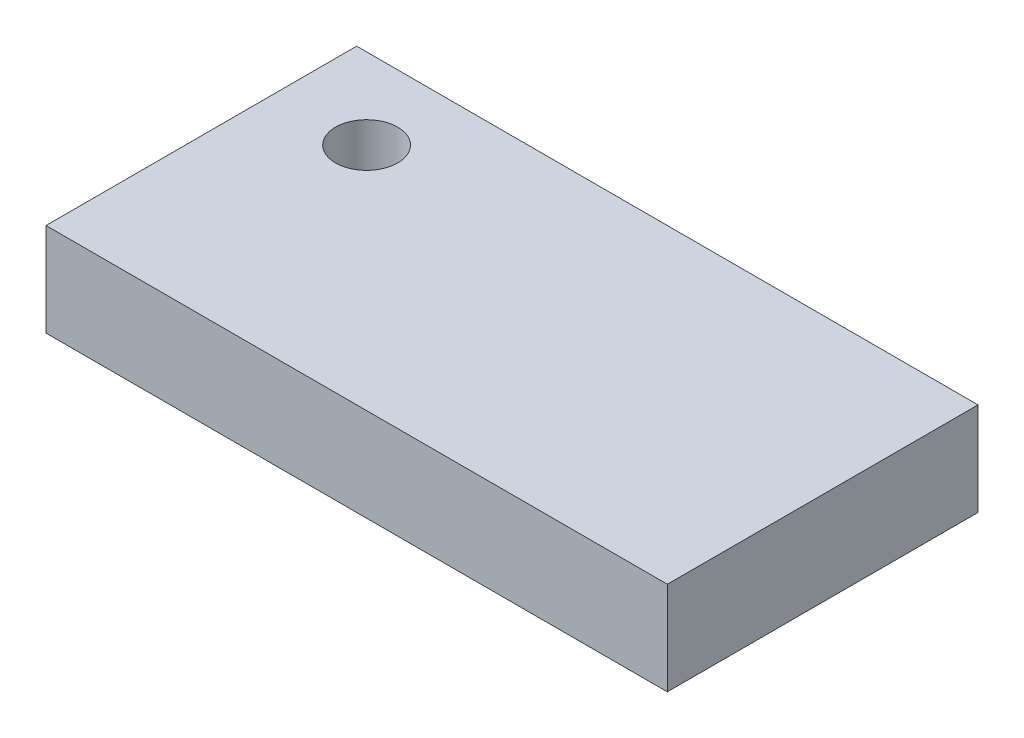
ISO-10303-21;
HEADER;
FILE_DESCRIPTION(('STEP AP214'),'2;1');
FILE_NAME('part.step','',(''),(''),'','','');
FILE_SCHEMA(('AUTOMOTIVE_DESIGN { 1 0 10303 214 1 1 1 1 }'));
ENDSEC;
DATA;
#1=APPLICATION_CONTEXT('core data for automotive mechanical design processes');
#2=APPLICATION_PROTOCOL_DEFINITION('international standard','automotive_design',2000,#1);
#3=PRODUCT_CONTEXT('',#1,'mechanical');
#4=PRODUCT('Part','Part','',(#3));
#5=PRODUCT_RELATED_PRODUCT_CATEGORY('part','',(#4));
#6=PRODUCT_DEFINITION_FORMATION('','',#4);
#7=PRODUCT_DEFINITION_CONTEXT('part definition',#1,'design');
#8=PRODUCT_DEFINITION('design','',#6,#7);
#9=PRODUCT_DEFINITION_SHAPE('','',#8);
#10=(LENGTH_UNIT() NAMED_UNIT(*) SI_UNIT(.MILLI.,.METRE.));
#11=(NAMED_UNIT(*) PLANE_ANGLE_UNIT() SI_UNIT($,.RADIAN.));
#12=(NAMED_UNIT(*) SI_UNIT($,.STERADIAN.) SOLID_ANGLE_UNIT());
#13=UNCERTAINTY_MEASURE_WITH_UNIT(LENGTH_MEASURE(1.E-05),#10,'distance_accuracy_value','');
#14=(GEOMETRIC_REPRESENTATION_CONTEXT(3) GLOBAL_UNCERTAINTY_ASSIGNED_CONTEXT((#13)) GLOBAL_UNIT_ASSIGNED_CONTEXT((#10,
#11,#12)) REPRESENTATION_CONTEXT('',''));
#15=CARTESIAN_POINT('',(0.,0.,0.));
#16=DIRECTION('',(0.,0.,1.));
#17=DIRECTION('',(1.,0.,0.));
#18=AXIS2_PLACEMENT_3D('',#15,#16,#17);
#19=CARTESIAN_POINT('',(50.,15.,16.3343558282208));
#20=DIRECTION('',(-1.,0.,0.));
#21=DIRECTION('',(0.,0.,1.));
#22=AXIS2_PLACEMENT_3D('',#19,#20,#21);
#23=PLANE('',#22);
#24=DIRECTION('',(0.,0.,-1.));
#25=VECTOR('',#24,1.);
#26=CARTESIAN_POINT('',(50.,0.,16.3343558282208));
#27=LINE('',#26,#25);
#28=CARTESIAN_POINT('',(50.,0.,16.3343558282208));
#29=VERTEX_POINT('',#28);
#30=CARTESIAN_POINT('',(50.,0.,-33.6656441717792));
#31=VERTEX_POINT('',#30);
#32=EDGE_CURVE('E96',#29,#31,#27,.T.);
#33=ORIENTED_EDGE('',*,*,#32,.T.);
#34=DIRECTION('',(0.,-1.,0.));
#35=VECTOR('',#34,1.);
#36=CARTESIAN_POINT('',(50.,15.,-33.6656441717792));
#37=LINE('',#36,#35);
#38=CARTESIAN_POINT('',(50.,15.,-33.6656441717792));
#39=VERTEX_POINT('',#38);
#40=EDGE_CURVE('E11',#39,#31,#37,.T.);
#41=ORIENTED_EDGE('',*,*,#40,.F.);
#42=DIRECTION('',(0.,0.,-1.));
#43=VECTOR('',#42,1.);
#44=CARTESIAN_POINT('',(50.,15.,16.3343558282208));
#45=LINE('',#44,#43);
#46=CARTESIAN_POINT('',(50.,15.,16.3343558282208));
#47=VERTEX_POINT('',#46);
#48=EDGE_CURVE('E84',#47,#39,#45,.T.);
#49=ORIENTED_EDGE('',*,*,#48,.F.);
#50=DIRECTION('',(0.,-1.,0.));
#51=VECTOR('',#50,1.);
#52=CARTESIAN_POINT('',(50.,15.,16.3343558282208));
#53=LINE('',#52,#51);
#54=EDGE_CURVE('E92',#47,#29,#53,.T.);
#55=ORIENTED_EDGE('',*,*,#54,.T.);
#56=EDGE_LOOP('',(#33,#41,#49,#55));
#57=FACE_BOUND('',#56,.T.);
#58=ADVANCED_FACE('F33',(#57),#23,.F.);
#59=CARTESIAN_POINT('',(-50.,15.,-33.6656441717792));
#60=DIRECTION('',(0.,0.,1.));
#61=DIRECTION('',(1.,0.,0.));
#62=AXIS2_PLACEMENT_3D('',#59,#60,#61);
#63=PLANE('',#62);
#64=DIRECTION('',(-1.,0.,0.));
#65=VECTOR('',#64,1.);
#66=CARTESIAN_POINT('',(-50.,0.,-33.6656441717792));
#67=LINE('',#66,#65);
#68=CARTESIAN_POINT('',(-50.,0.,-33.6656441717792));
#69=VERTEX_POINT('',#68);
#70=EDGE_CURVE('E88',#31,#69,#67,.T.);
#71=ORIENTED_EDGE('',*,*,#70,.T.);
#72=DIRECTION('',(0.,-1.,0.));
#73=VECTOR('',#72,1.);
#74=CARTESIAN_POINT('',(-50.,15.,-33.6656441717792));
#75=LINE('',#74,#73);
#76=CARTESIAN_POINT('',(-50.,15.,-33.6656441717792));
#77=VERTEX_POINT('',#76);
#78=EDGE_CURVE('E41',#77,#69,#75,.T.);
#79=ORIENTED_EDGE('',*,*,#78,.F.);
#80=DIRECTION('',(-1.,0.,0.));
#81=VECTOR('',#80,1.);
#82=CARTESIAN_POINT('',(-50.,15.,-33.6656441717792));
#83=LINE('',#82,#81);
#84=EDGE_CURVE('E79',#39,#77,#83,.T.);
#85=ORIENTED_EDGE('',*,*,#84,.F.);
#86=ORIENTED_EDGE('',*,*,#40,.T.);
#87=EDGE_LOOP('',(#71,#79,#85,#86));
#88=FACE_BOUND('',#87,.T.);
#89=ADVANCED_FACE('F87',(#88),#63,.F.);
#90=CARTESIAN_POINT('',(-50.,15.,16.3343558282208));
#91=DIRECTION('',(1.,0.,0.));
#92=DIRECTION('',(0.,0.,-1.));
#93=AXIS2_PLACEMENT_3D('',#90,#91,#92);
#94=PLANE('',#93);
#95=DIRECTION('',(0.,0.,1.));
#96=VECTOR('',#95,1.);
#97=CARTESIAN_POINT('',(-50.,0.,16.3343558282208));
#98=LINE('',#97,#96);
#99=CARTESIAN_POINT('',(-50.,0.,16.3343558282208));
#100=VERTEX_POINT('',#99);
#101=EDGE_CURVE('E66',#69,#100,#98,.T.);
#102=ORIENTED_EDGE('',*,*,#101,.T.);
#103=DIRECTION('',(0.,-1.,0.));
#104=VECTOR('',#103,1.);
#105=CARTESIAN_POINT('',(-50.,15.,16.3343558282208));
#106=LINE('',#105,#104);
#107=CARTESIAN_POINT('',(-50.,15.,16.3343558282208));
#108=VERTEX_POINT('',#107);
#109=EDGE_CURVE('E89',#108,#100,#106,.T.);
#110=ORIENTED_EDGE('',*,*,#109,.F.);
#111=DIRECTION('',(0.,0.,1.));
#112=VECTOR('',#111,1.);
#113=CARTESIAN_POINT('',(-50.,15.,16.3343558282208));
#114=LINE('',#113,#112);
#115=EDGE_CURVE('E82',#77,#108,#114,.T.);
#116=ORIENTED_EDGE('',*,*,#115,.F.);
#117=ORIENTED_EDGE('',*,*,#78,.T.);
#118=EDGE_LOOP('',(#102,#110,#116,#117));
#119=FACE_BOUND('',#118,.T.);
#120=ADVANCED_FACE('F90',(#119),#94,.F.);
#121=CARTESIAN_POINT('',(-50.,15.,16.3343558282208));
#122=DIRECTION('',(0.,0.,-1.));
#123=DIRECTION('',(-1.,0.,0.));
#124=AXIS2_PLACEMENT_3D('',#121,#122,#123);
#125=PLANE('',#124);
#126=DIRECTION('',(1.,0.,0.));
#127=VECTOR('',#126,1.);
#128=CARTESIAN_POINT('',(-50.,0.,16.3343558282208));
#129=LINE('',#128,#127);
#130=EDGE_CURVE('E72',#100,#29,#129,.T.);
#131=ORIENTED_EDGE('',*,*,#130,.T.);
#132=ORIENTED_EDGE('',*,*,#54,.F.);
#133=DIRECTION('',(1.,0.,0.));
#134=VECTOR('',#133,1.);
#135=CARTESIAN_POINT('',(-50.,15.,16.3343558282208));
#136=LINE('',#135,#134);
#137=EDGE_CURVE('E49',#108,#47,#136,.T.);
#138=ORIENTED_EDGE('',*,*,#137,.F.);
#139=ORIENTED_EDGE('',*,*,#109,.T.);
#140=EDGE_LOOP('',(#131,#132,#138,#139));
#141=FACE_BOUND('',#140,.T.);
#142=ADVANCED_FACE('F104',(#141),#125,.F.);
#143=CARTESIAN_POINT('',(0.,15.,0.));
#144=DIRECTION('',(0.,-1.,0.));
#145=DIRECTION('',(0.,0.,-1.));
#146=AXIS2_PLACEMENT_3D('',#143,#144,#145);
#147=PLANE('',#146);
#148=CARTESIAN_POINT('',(-35.4172076381492,15.,-20.6808613564249));
#149=DIRECTION('',(0.,1.,0.));
#150=DIRECTION('',(0.,0.,1.));
#151=AXIS2_PLACEMENT_3D('',#148,#149,#150);
#152=CIRCLE('',#151,5.);
#153=CARTESIAN_POINT('',(-35.4172076381492,15.,-15.6808613564249));
#154=VERTEX_POINT('',#153);
#155=EDGE_CURVE('E110',#154,#154,#152,.T.);
#156=ORIENTED_EDGE('',*,*,#155,.F.);
#157=EDGE_LOOP('',(#156));
#158=FACE_BOUND('',#157,.T.);
#159=ORIENTED_EDGE('',*,*,#48,.T.);
#160=ORIENTED_EDGE('',*,*,#84,.T.);
#161=ORIENTED_EDGE('',*,*,#115,.T.);
#162=ORIENTED_EDGE('',*,*,#137,.T.);
#163=EDGE_LOOP('',(#159,#160,#161,#162));
#164=FACE_BOUND('',#163,.T.);
#165=ADVANCED_FACE('F80',(#158,#164),#147,.F.);
#166=CARTESIAN_POINT('',(0.,0.,0.));
#167=DIRECTION('',(0.,-1.,0.));
#168=DIRECTION('',(0.,0.,-1.));
#169=AXIS2_PLACEMENT_3D('',#166,#167,#168);
#170=PLANE('',#169);
#171=ORIENTED_EDGE('',*,*,#32,.F.);
#172=ORIENTED_EDGE('',*,*,#130,.F.);
#173=ORIENTED_EDGE('',*,*,#101,.F.);
#174=ORIENTED_EDGE('',*,*,#70,.F.);
#175=EDGE_LOOP('',(#171,#172,#173,#174));
#176=FACE_BOUND('',#175,.T.);
#177=ADVANCED_FACE('F107',(#176),#170,.T.);
#178=CARTESIAN_POINT('',(-35.4172076381492,5.,-20.6808613564249));
#179=DIRECTION('',(0.,1.,0.));
#180=DIRECTION('',(0.,0.,1.));
#181=AXIS2_PLACEMENT_3D('',#178,#179,#180);
#182=CYLINDRICAL_SURFACE('',#181,5.);
#183=CARTESIAN_POINT('',(-35.4172076381492,5.,-20.6808613564249));
#184=DIRECTION('',(0.,1.,0.));
#185=DIRECTION('',(0.,0.,1.));
#186=AXIS2_PLACEMENT_3D('',#183,#184,#185);
#187=CIRCLE('',#186,5.);
#188=CARTESIAN_POINT('',(-35.4172076381492,5.,-15.6808613564249));
#189=VERTEX_POINT('',#188);
#190=EDGE_CURVE('E99',#189,#189,#187,.T.);
#191=ORIENTED_EDGE('',*,*,#190,.F.);
#192=EDGE_LOOP('',(#191));
#193=FACE_BOUND('',#192,.T.);
#194=ORIENTED_EDGE('',*,*,#155,.T.);
#195=EDGE_LOOP('',(#194));
#196=FACE_BOUND('',#195,.T.);
#197=ADVANCED_FACE('F118',(#193,#196),#182,.F.);
#198=CARTESIAN_POINT('',(-35.4172076381492,5.,-20.6808613564249));
#199=DIRECTION('',(0.,1.,0.));
#200=DIRECTION('',(0.,0.,1.));
#201=AXIS2_PLACEMENT_3D('',#198,#199,#200);
#202=PLANE('',#201);
#203=ORIENTED_EDGE('',*,*,#190,.T.);
#204=EDGE_LOOP('',(#203));
#205=FACE_BOUND('',#204,.T.);
#206=ADVANCED_FACE('F116',(#205),#202,.T.);
#207=CLOSED_SHELL('',(#58,#89,#120,#142,#165,#177,#197,#206));
#208=MANIFOLD_SOLID_BREP('B2',#207);
#209=ADVANCED_BREP_SHAPE_REPRESENTATION('',(#18,#208),#14);
#210=SHAPE_DEFINITION_REPRESENTATION(#9,#209);
ENDSEC;
END-ISO-10303-21;
